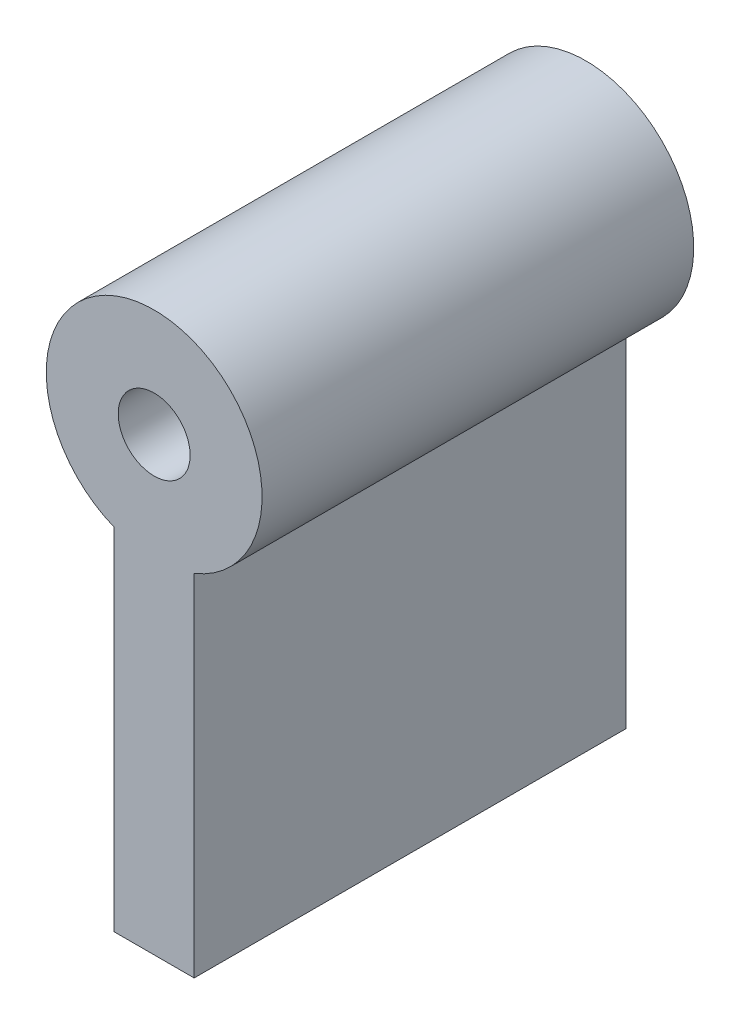
ISO-10303-21;
HEADER;
FILE_DESCRIPTION(('STEP AP214'),'2;1');
FILE_NAME('part.step','',(''),(''),'','','');
FILE_SCHEMA(('AUTOMOTIVE_DESIGN { 1 0 10303 214 1 1 1 1 }'));
ENDSEC;
DATA;
#1=APPLICATION_CONTEXT('core data for automotive mechanical design processes');
#2=APPLICATION_PROTOCOL_DEFINITION('international standard','automotive_design',2000,#1);
#3=PRODUCT_CONTEXT('',#1,'mechanical');
#4=PRODUCT('Part','Part','',(#3));
#5=PRODUCT_RELATED_PRODUCT_CATEGORY('part','',(#4));
#6=PRODUCT_DEFINITION_FORMATION('','',#4);
#7=PRODUCT_DEFINITION_CONTEXT('part definition',#1,'design');
#8=PRODUCT_DEFINITION('design','',#6,#7);
#9=PRODUCT_DEFINITION_SHAPE('','',#8);
#10=(LENGTH_UNIT() NAMED_UNIT(*) SI_UNIT(.MILLI.,.METRE.));
#11=(NAMED_UNIT(*) PLANE_ANGLE_UNIT() SI_UNIT($,.RADIAN.));
#12=(NAMED_UNIT(*) SI_UNIT($,.STERADIAN.) SOLID_ANGLE_UNIT());
#13=UNCERTAINTY_MEASURE_WITH_UNIT(LENGTH_MEASURE(1.E-05),#10,'distance_accuracy_value','');
#14=(GEOMETRIC_REPRESENTATION_CONTEXT(3) GLOBAL_UNCERTAINTY_ASSIGNED_CONTEXT((#13)) GLOBAL_UNIT_ASSIGNED_CONTEXT((#10,
#11,#12)) REPRESENTATION_CONTEXT('',''));
#15=CARTESIAN_POINT('',(0.,0.,0.));
#16=DIRECTION('',(0.,0.,1.));
#17=DIRECTION('',(1.,0.,0.));
#18=AXIS2_PLACEMENT_3D('',#15,#16,#17);
#19=CARTESIAN_POINT('',(0.,0.,30.));
#20=DIRECTION('',(0.,0.,1.));
#21=DIRECTION('',(1.,0.,0.));
#22=AXIS2_PLACEMENT_3D('',#19,#20,#21);
#23=PLANE('',#22);
#24=CARTESIAN_POINT('',(0.,0.,30.));
#25=DIRECTION('',(0.,0.,1.));
#26=DIRECTION('',(1.,0.,0.));
#27=AXIS2_PLACEMENT_3D('',#24,#25,#26);
#28=CIRCLE('',#27,15.);
#29=CARTESIAN_POINT('',(5.5576064521285,-13.9324445279089,30.));
#30=VERTEX_POINT('',#29);
#31=CARTESIAN_POINT('',(-5.5576064521285,-13.9324445279089,30.));
#32=VERTEX_POINT('',#31);
#33=EDGE_CURVE('E80',#30,#32,#28,.T.);
#34=ORIENTED_EDGE('',*,*,#33,.T.);
#35=DIRECTION('',(0.,-1.,0.));
#36=VECTOR('',#35,1.);
#37=CARTESIAN_POINT('',(-5.5576064521285,-13.9324445279089,30.));
#38=LINE('',#37,#36);
#39=CARTESIAN_POINT('',(-5.5576064521285,-62.6422800075539,30.));
#40=VERTEX_POINT('',#39);
#41=EDGE_CURVE('E53',#32,#40,#38,.T.);
#42=ORIENTED_EDGE('',*,*,#41,.T.);
#43=DIRECTION('',(1.,0.,0.));
#44=VECTOR('',#43,1.);
#45=CARTESIAN_POINT('',(-5.5576064521285,-62.6422800075539,30.));
#46=LINE('',#45,#44);
#47=CARTESIAN_POINT('',(5.5576064521285,-62.6422800075539,30.));
#48=VERTEX_POINT('',#47);
#49=EDGE_CURVE('E110',#40,#48,#46,.T.);
#50=ORIENTED_EDGE('',*,*,#49,.T.);
#51=DIRECTION('',(0.,-1.,0.));
#52=VECTOR('',#51,1.);
#53=CARTESIAN_POINT('',(5.5576064521285,-13.9324445279089,30.));
#54=LINE('',#53,#52);
#55=EDGE_CURVE('E85',#30,#48,#54,.T.);
#56=ORIENTED_EDGE('',*,*,#55,.F.);
#57=EDGE_LOOP('',(#34,#42,#50,#56));
#58=FACE_BOUND('',#57,.T.);
#59=CARTESIAN_POINT('',(0.,0.,30.));
#60=DIRECTION('',(0.,0.,1.));
#61=DIRECTION('',(1.,0.,0.));
#62=AXIS2_PLACEMENT_3D('',#59,#60,#61);
#63=CIRCLE('',#62,5.);
#64=CARTESIAN_POINT('',(5.,0.,30.));
#65=VERTEX_POINT('',#64);
#66=EDGE_CURVE('E93',#65,#65,#63,.T.);
#67=ORIENTED_EDGE('',*,*,#66,.F.);
#68=EDGE_LOOP('',(#67));
#69=FACE_BOUND('',#68,.T.);
#70=ADVANCED_FACE('F37',(#58,#69),#23,.T.);
#71=CARTESIAN_POINT('',(0.,0.,30.));
#72=DIRECTION('',(0.,0.,-1.));
#73=DIRECTION('',(-1.,0.,0.));
#74=AXIS2_PLACEMENT_3D('',#71,#72,#73);
#75=CYLINDRICAL_SURFACE('',#74,15.);
#76=DIRECTION('',(0.,0.,-1.));
#77=VECTOR('',#76,1.);
#78=CARTESIAN_POINT('',(5.5576064521285,-13.9324445279089,30.));
#79=LINE('',#78,#77);
#80=CARTESIAN_POINT('',(5.5576064521285,-13.9324445279089,-30.));
#81=VERTEX_POINT('',#80);
#82=EDGE_CURVE('E41',#30,#81,#79,.T.);
#83=ORIENTED_EDGE('',*,*,#82,.T.);
#84=CARTESIAN_POINT('',(0.,0.,-30.));
#85=DIRECTION('',(0.,0.,1.));
#86=DIRECTION('',(1.,0.,0.));
#87=AXIS2_PLACEMENT_3D('',#84,#85,#86);
#88=CIRCLE('',#87,15.);
#89=CARTESIAN_POINT('',(-5.5576064521285,-13.9324445279089,-30.));
#90=VERTEX_POINT('',#89);
#91=EDGE_CURVE('E79',#81,#90,#88,.T.);
#92=ORIENTED_EDGE('',*,*,#91,.T.);
#93=DIRECTION('',(0.,0.,-1.));
#94=VECTOR('',#93,1.);
#95=CARTESIAN_POINT('',(-5.5576064521285,-13.9324445279089,30.));
#96=LINE('',#95,#94);
#97=EDGE_CURVE('E11',#32,#90,#96,.T.);
#98=ORIENTED_EDGE('',*,*,#97,.F.);
#99=ORIENTED_EDGE('',*,*,#33,.F.);
#100=EDGE_LOOP('',(#83,#92,#98,#99));
#101=FACE_BOUND('',#100,.T.);
#102=ADVANCED_FACE('F39',(#101),#75,.T.);
#103=CARTESIAN_POINT('',(-5.5576064521285,-13.9324445279089,30.));
#104=DIRECTION('',(1.,0.,0.));
#105=DIRECTION('',(0.,0.,-1.));
#106=AXIS2_PLACEMENT_3D('',#103,#104,#105);
#107=PLANE('',#106);
#108=ORIENTED_EDGE('',*,*,#97,.T.);
#109=DIRECTION('',(0.,-1.,0.));
#110=VECTOR('',#109,1.);
#111=CARTESIAN_POINT('',(-5.5576064521285,-13.9324445279089,-30.));
#112=LINE('',#111,#110);
#113=CARTESIAN_POINT('',(-5.5576064521285,-62.6422800075539,-30.));
#114=VERTEX_POINT('',#113);
#115=EDGE_CURVE('E99',#90,#114,#112,.T.);
#116=ORIENTED_EDGE('',*,*,#115,.T.);
#117=DIRECTION('',(0.,0.,-1.));
#118=VECTOR('',#117,1.);
#119=CARTESIAN_POINT('',(-5.5576064521285,-62.6422800075539,30.));
#120=LINE('',#119,#118);
#121=EDGE_CURVE('E46',#40,#114,#120,.T.);
#122=ORIENTED_EDGE('',*,*,#121,.F.);
#123=ORIENTED_EDGE('',*,*,#41,.F.);
#124=EDGE_LOOP('',(#108,#116,#122,#123));
#125=FACE_BOUND('',#124,.T.);
#126=ADVANCED_FACE('F117',(#125),#107,.F.);
#127=CARTESIAN_POINT('',(-5.5576064521285,-62.6422800075539,30.));
#128=DIRECTION('',(0.,1.,0.));
#129=DIRECTION('',(0.,0.,1.));
#130=AXIS2_PLACEMENT_3D('',#127,#128,#129);
#131=PLANE('',#130);
#132=ORIENTED_EDGE('',*,*,#121,.T.);
#133=DIRECTION('',(1.,0.,0.));
#134=VECTOR('',#133,1.);
#135=CARTESIAN_POINT('',(-5.5576064521285,-62.6422800075539,-30.));
#136=LINE('',#135,#134);
#137=CARTESIAN_POINT('',(5.5576064521285,-62.6422800075539,-30.));
#138=VERTEX_POINT('',#137);
#139=EDGE_CURVE('E94',#114,#138,#136,.T.);
#140=ORIENTED_EDGE('',*,*,#139,.T.);
#141=DIRECTION('',(0.,0.,-1.));
#142=VECTOR('',#141,1.);
#143=CARTESIAN_POINT('',(5.5576064521285,-62.6422800075539,30.));
#144=LINE('',#143,#142);
#145=EDGE_CURVE('E84',#48,#138,#144,.T.);
#146=ORIENTED_EDGE('',*,*,#145,.F.);
#147=ORIENTED_EDGE('',*,*,#49,.F.);
#148=EDGE_LOOP('',(#132,#140,#146,#147));
#149=FACE_BOUND('',#148,.T.);
#150=ADVANCED_FACE('F116',(#149),#131,.F.);
#151=CARTESIAN_POINT('',(5.5576064521285,-13.9324445279089,30.));
#152=DIRECTION('',(1.,0.,0.));
#153=DIRECTION('',(0.,1.,0.));
#154=AXIS2_PLACEMENT_3D('',#151,#152,#153);
#155=PLANE('',#154);
#156=ORIENTED_EDGE('',*,*,#145,.T.);
#157=DIRECTION('',(0.,-1.,0.));
#158=VECTOR('',#157,1.);
#159=CARTESIAN_POINT('',(5.5576064521285,-13.9324445279089,-30.));
#160=LINE('',#159,#158);
#161=EDGE_CURVE('E87',#81,#138,#160,.T.);
#162=ORIENTED_EDGE('',*,*,#161,.F.);
#163=ORIENTED_EDGE('',*,*,#82,.F.);
#164=ORIENTED_EDGE('',*,*,#55,.T.);
#165=EDGE_LOOP('',(#156,#162,#163,#164));
#166=FACE_BOUND('',#165,.T.);
#167=ADVANCED_FACE('F88',(#166),#155,.T.);
#168=CARTESIAN_POINT('',(0.,0.,30.));
#169=DIRECTION('',(0.,0.,-1.));
#170=DIRECTION('',(-1.,0.,0.));
#171=AXIS2_PLACEMENT_3D('',#168,#169,#170);
#172=CYLINDRICAL_SURFACE('',#171,5.);
#173=ORIENTED_EDGE('',*,*,#66,.T.);
#174=EDGE_LOOP('',(#173));
#175=FACE_BOUND('',#174,.T.);
#176=CARTESIAN_POINT('',(0.,0.,-30.));
#177=DIRECTION('',(0.,0.,1.));
#178=DIRECTION('',(1.,0.,0.));
#179=AXIS2_PLACEMENT_3D('',#176,#177,#178);
#180=CIRCLE('',#179,5.);
#181=CARTESIAN_POINT('',(5.,0.,-30.));
#182=VERTEX_POINT('',#181);
#183=EDGE_CURVE('E100',#182,#182,#180,.T.);
#184=ORIENTED_EDGE('',*,*,#183,.F.);
#185=EDGE_LOOP('',(#184));
#186=FACE_BOUND('',#185,.T.);
#187=ADVANCED_FACE('F131',(#175,#186),#172,.F.);
#188=CARTESIAN_POINT('',(0.,0.,-30.));
#189=DIRECTION('',(0.,0.,1.));
#190=DIRECTION('',(1.,0.,0.));
#191=AXIS2_PLACEMENT_3D('',#188,#189,#190);
#192=PLANE('',#191);
#193=ORIENTED_EDGE('',*,*,#183,.T.);
#194=EDGE_LOOP('',(#193));
#195=FACE_BOUND('',#194,.T.);
#196=ORIENTED_EDGE('',*,*,#91,.F.);
#197=ORIENTED_EDGE('',*,*,#161,.T.);
#198=ORIENTED_EDGE('',*,*,#139,.F.);
#199=ORIENTED_EDGE('',*,*,#115,.F.);
#200=EDGE_LOOP('',(#196,#197,#198,#199));
#201=FACE_BOUND('',#200,.T.);
#202=ADVANCED_FACE('F97',(#195,#201),#192,.F.);
#203=CLOSED_SHELL('',(#70,#102,#126,#150,#167,#187,#202));
#204=MANIFOLD_SOLID_BREP('B2',#203);
#205=ADVANCED_BREP_SHAPE_REPRESENTATION('',(#18,#204),#14);
#206=SHAPE_DEFINITION_REPRESENTATION(#9,#205);
ENDSEC;
END-ISO-10303-21;
